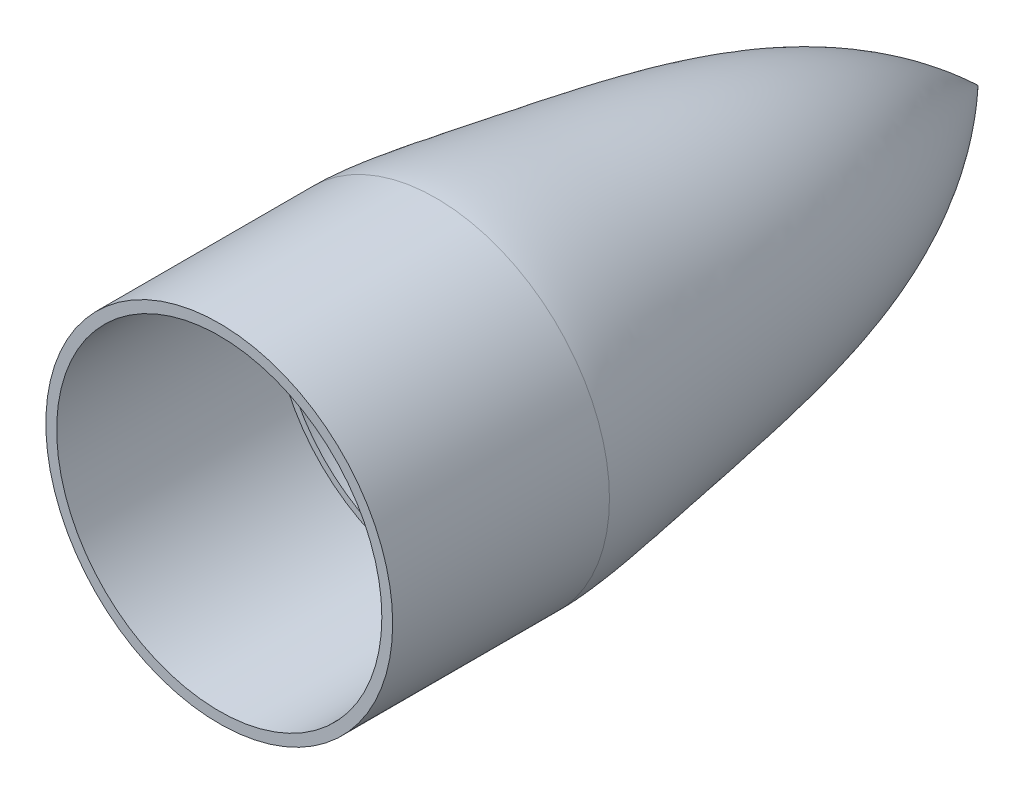
ISO-10303-21;
HEADER;
FILE_DESCRIPTION(('STEP AP214'),'2;1');
FILE_NAME('part.step','',(''),(''),'','','');
FILE_SCHEMA(('AUTOMOTIVE_DESIGN { 1 0 10303 214 1 1 1 1 }'));
ENDSEC;
DATA;
#1=APPLICATION_CONTEXT('core data for automotive mechanical design processes');
#2=APPLICATION_PROTOCOL_DEFINITION('international standard','automotive_design',2000,#1);
#3=PRODUCT_CONTEXT('',#1,'mechanical');
#4=PRODUCT('Part','Part','',(#3));
#5=PRODUCT_RELATED_PRODUCT_CATEGORY('part','',(#4));
#6=PRODUCT_DEFINITION_FORMATION('','',#4);
#7=PRODUCT_DEFINITION_CONTEXT('part definition',#1,'design');
#8=PRODUCT_DEFINITION('design','',#6,#7);
#9=PRODUCT_DEFINITION_SHAPE('','',#8);
#10=(LENGTH_UNIT() NAMED_UNIT(*) SI_UNIT(.MILLI.,.METRE.));
#11=(NAMED_UNIT(*) PLANE_ANGLE_UNIT() SI_UNIT($,.RADIAN.));
#12=(NAMED_UNIT(*) SI_UNIT($,.STERADIAN.) SOLID_ANGLE_UNIT());
#13=UNCERTAINTY_MEASURE_WITH_UNIT(LENGTH_MEASURE(1.E-05),#10,'distance_accuracy_value','');
#14=(GEOMETRIC_REPRESENTATION_CONTEXT(3) GLOBAL_UNCERTAINTY_ASSIGNED_CONTEXT((#13)) GLOBAL_UNIT_ASSIGNED_CONTEXT((#10,
#11,#12)) REPRESENTATION_CONTEXT('',''));
#15=CARTESIAN_POINT('',(0.,0.,0.));
#16=DIRECTION('',(0.,0.,1.));
#17=DIRECTION('',(1.,0.,0.));
#18=AXIS2_PLACEMENT_3D('',#15,#16,#17);
#19=CARTESIAN_POINT('',(14.4,0.,-20.));
#20=CARTESIAN_POINT('',(14.4,0.,-22.1569243272056));
#21=CARTESIAN_POINT('',(10.88975842026,0.,-43.0378035395495));
#22=CARTESIAN_POINT('',(10.6207722295566,0.,-57.3163167805024));
#23=CARTESIAN_POINT('',(0.,0.,-68.4));
#24=B_SPLINE_CURVE_WITH_KNOTS('',3,(#19,#20,#21,#22,#23),.UNSPECIFIED.,.F.,.F.,(4,1,4),(0.,
0.204356335938938,1.),.UNSPECIFIED.);
#25=CARTESIAN_POINT('',(0.,0.,-21.2081306779086));
#26=DIRECTION('',(0.,0.,1.));
#27=AXIS1_PLACEMENT('',#25,#26);
#28=SURFACE_OF_REVOLUTION('',#24,#27);
#29=CARTESIAN_POINT('',(0.,0.,-68.4));
#30=VERTEX_POINT('',#29);
#31=VERTEX_LOOP('',#30);
#32=FACE_BOUND('',#31,.T.);
#33=CARTESIAN_POINT('',(0.,0.,-20.));
#34=DIRECTION('',(0.,0.,1.));
#35=DIRECTION('',(1.,0.,0.));
#36=AXIS2_PLACEMENT_3D('',#33,#34,#35);
#37=CIRCLE('',#36,14.4);
#38=CARTESIAN_POINT('',(14.4,0.,-20.));
#39=VERTEX_POINT('',#38);
#40=EDGE_CURVE('E11',#39,#39,#37,.T.);
#41=ORIENTED_EDGE('',*,*,#40,.T.);
#42=EDGE_LOOP('',(#41));
#43=FACE_BOUND('',#42,.T.);
#44=ADVANCED_FACE('F38',(#32,#43),#28,.T.);
#45=CARTESIAN_POINT('',(0.,0.,-20.));
#46=DIRECTION('',(0.,0.,-1.));
#47=DIRECTION('',(-1.,0.,0.));
#48=AXIS2_PLACEMENT_3D('',#45,#46,#47);
#49=PLANE('',#48);
#50=ORIENTED_EDGE('',*,*,#40,.F.);
#51=EDGE_LOOP('',(#50));
#52=FACE_BOUND('',#51,.T.);
#53=CARTESIAN_POINT('',(0.,0.,-20.));
#54=DIRECTION('',(0.,0.,1.));
#55=DIRECTION('',(1.,0.,0.));
#56=AXIS2_PLACEMENT_3D('',#53,#54,#55);
#57=CIRCLE('',#56,15.);
#58=CARTESIAN_POINT('',(15.,0.,-20.));
#59=VERTEX_POINT('',#58);
#60=EDGE_CURVE('E46',#59,#59,#57,.T.);
#61=ORIENTED_EDGE('',*,*,#60,.T.);
#62=EDGE_LOOP('',(#61));
#63=FACE_BOUND('',#62,.T.);
#64=ADVANCED_FACE('F75',(#52,#63),#49,.F.);
#65=CARTESIAN_POINT('',(0.,0.,-21.2081306779086));
#66=DIRECTION('',(0.,0.,1.));
#67=DIRECTION('',(1.,0.,0.));
#68=AXIS2_PLACEMENT_3D('',#65,#66,#67);
#69=CYLINDRICAL_SURFACE('',#68,15.);
#70=ORIENTED_EDGE('',*,*,#60,.F.);
#71=EDGE_LOOP('',(#70));
#72=FACE_BOUND('',#71,.T.);
#73=CARTESIAN_POINT('',(0.,0.,0.));
#74=DIRECTION('',(0.,0.,1.));
#75=DIRECTION('',(1.,0.,0.));
#76=AXIS2_PLACEMENT_3D('',#73,#74,#75);
#77=CIRCLE('',#76,15.);
#78=CARTESIAN_POINT('',(15.,0.,0.));
#79=VERTEX_POINT('',#78);
#80=EDGE_CURVE('E64',#79,#79,#77,.T.);
#81=ORIENTED_EDGE('',*,*,#80,.T.);
#82=EDGE_LOOP('',(#81));
#83=FACE_BOUND('',#82,.T.);
#84=ADVANCED_FACE('F77',(#72,#83),#69,.F.);
#85=CARTESIAN_POINT('',(0.,0.,0.));
#86=DIRECTION('',(0.,0.,-1.));
#87=DIRECTION('',(-1.,0.,0.));
#88=AXIS2_PLACEMENT_3D('',#85,#86,#87);
#89=PLANE('',#88);
#90=ORIENTED_EDGE('',*,*,#80,.F.);
#91=EDGE_LOOP('',(#90));
#92=FACE_BOUND('',#91,.T.);
#93=CARTESIAN_POINT('',(0.,0.,0.));
#94=DIRECTION('',(0.,0.,1.));
#95=DIRECTION('',(1.,0.,0.));
#96=AXIS2_PLACEMENT_3D('',#93,#94,#95);
#97=CIRCLE('',#96,16.);
#98=CARTESIAN_POINT('',(16.,0.,0.));
#99=VERTEX_POINT('',#98);
#100=EDGE_CURVE('E61',#99,#99,#97,.T.);
#101=ORIENTED_EDGE('',*,*,#100,.T.);
#102=EDGE_LOOP('',(#101));
#103=FACE_BOUND('',#102,.T.);
#104=ADVANCED_FACE('F80',(#92,#103),#89,.F.);
#105=CARTESIAN_POINT('',(0.,0.,-21.2081306779086));
#106=DIRECTION('',(0.,0.,1.));
#107=DIRECTION('',(1.,0.,0.));
#108=AXIS2_PLACEMENT_3D('',#105,#106,#107);
#109=CYLINDRICAL_SURFACE('',#108,16.);
#110=ORIENTED_EDGE('',*,*,#100,.F.);
#111=EDGE_LOOP('',(#110));
#112=FACE_BOUND('',#111,.T.);
#113=CARTESIAN_POINT('',(0.,0.,-20.));
#114=DIRECTION('',(0.,0.,1.));
#115=DIRECTION('',(1.,0.,0.));
#116=AXIS2_PLACEMENT_3D('',#113,#114,#115);
#117=CIRCLE('',#116,16.);
#118=CARTESIAN_POINT('',(16.,0.,-20.));
#119=VERTEX_POINT('',#118);
#120=EDGE_CURVE('E59',#119,#119,#117,.T.);
#121=ORIENTED_EDGE('',*,*,#120,.T.);
#122=EDGE_LOOP('',(#121));
#123=FACE_BOUND('',#122,.T.);
#124=ADVANCED_FACE('F55',(#112,#123),#109,.T.);
#125=CARTESIAN_POINT('',(16.,0.,-20.));
#126=CARTESIAN_POINT('',(16.,0.,-23.0077215608056));
#127=CARTESIAN_POINT('',(12.4424756709133,0.,-43.7503184521586));
#128=CARTESIAN_POINT('',(10.3576406505098,0.,-59.0892774218946));
#129=CARTESIAN_POINT('',(0.,0.,-70.));
#130=B_SPLINE_CURVE_WITH_KNOTS('',3,(#125,#126,#127,#128,#129),.UNSPECIFIED.,.F.,.F.,(4,1,4),
(0.,0.236447311873001,1.),.UNSPECIFIED.);
#131=CARTESIAN_POINT('',(0.,0.,-21.2081306779086));
#132=DIRECTION('',(0.,0.,1.));
#133=AXIS1_PLACEMENT('',#131,#132);
#134=SURFACE_OF_REVOLUTION('',#130,#133);
#135=CARTESIAN_POINT('',(0.,0.,-70.));
#136=VERTEX_POINT('',#135);
#137=VERTEX_LOOP('',#136);
#138=FACE_BOUND('',#137,.T.);
#139=ORIENTED_EDGE('',*,*,#120,.F.);
#140=EDGE_LOOP('',(#139));
#141=FACE_BOUND('',#140,.T.);
#142=ADVANCED_FACE('F52',(#138,#141),#134,.F.);
#143=CLOSED_SHELL('',(#44,#64,#84,#104,#124,#142));
#144=MANIFOLD_SOLID_BREP('B2',#143);
#145=ADVANCED_BREP_SHAPE_REPRESENTATION('',(#18,#144),#14);
#146=SHAPE_DEFINITION_REPRESENTATION(#9,#145);
ENDSEC;
END-ISO-10303-21;
